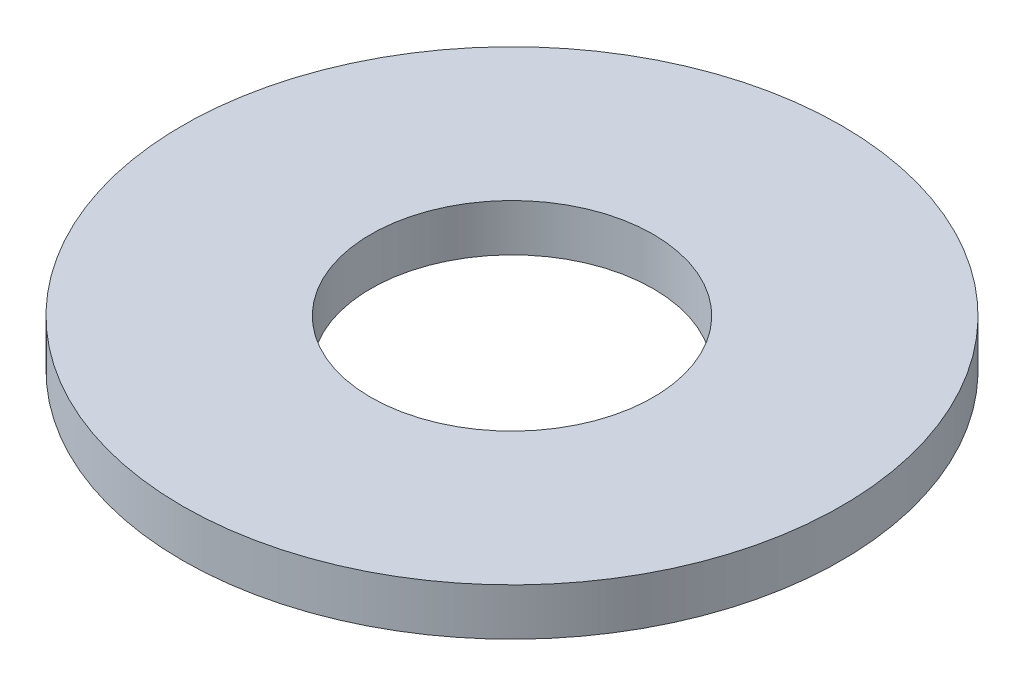
ISO-10303-21;
HEADER;
FILE_DESCRIPTION(('STEP AP214'),'2;1');
FILE_NAME('part.step','',(''),(''),'','','');
FILE_SCHEMA(('AUTOMOTIVE_DESIGN { 1 0 10303 214 1 1 1 1 }'));
ENDSEC;
DATA;
#1=APPLICATION_CONTEXT('core data for automotive mechanical design processes');
#2=APPLICATION_PROTOCOL_DEFINITION('international standard','automotive_design',2000,#1);
#3=PRODUCT_CONTEXT('',#1,'mechanical');
#4=PRODUCT('Part','Part','',(#3));
#5=PRODUCT_RELATED_PRODUCT_CATEGORY('part','',(#4));
#6=PRODUCT_DEFINITION_FORMATION('','',#4);
#7=PRODUCT_DEFINITION_CONTEXT('part definition',#1,'design');
#8=PRODUCT_DEFINITION('design','',#6,#7);
#9=PRODUCT_DEFINITION_SHAPE('','',#8);
#10=(LENGTH_UNIT() NAMED_UNIT(*) SI_UNIT(.MILLI.,.METRE.));
#11=(NAMED_UNIT(*) PLANE_ANGLE_UNIT() SI_UNIT($,.RADIAN.));
#12=(NAMED_UNIT(*) SI_UNIT($,.STERADIAN.) SOLID_ANGLE_UNIT());
#13=UNCERTAINTY_MEASURE_WITH_UNIT(LENGTH_MEASURE(1.E-05),#10,'distance_accuracy_value','');
#14=(GEOMETRIC_REPRESENTATION_CONTEXT(3) GLOBAL_UNCERTAINTY_ASSIGNED_CONTEXT((#13)) GLOBAL_UNIT_ASSIGNED_CONTEXT((#10,
#11,#12)) REPRESENTATION_CONTEXT('',''));
#15=CARTESIAN_POINT('',(0.,0.,0.));
#16=DIRECTION('',(0.,0.,1.));
#17=DIRECTION('',(1.,0.,0.));
#18=AXIS2_PLACEMENT_3D('',#15,#16,#17);
#19=CARTESIAN_POINT('',(0.,5.,0.));
#20=DIRECTION('',(0.,1.,0.));
#21=DIRECTION('',(0.,0.,1.));
#22=AXIS2_PLACEMENT_3D('',#19,#20,#21);
#23=PLANE('',#22);
#24=CARTESIAN_POINT('',(0.,5.,0.));
#25=DIRECTION('',(0.,1.,0.));
#26=DIRECTION('',(0.,0.,1.));
#27=AXIS2_PLACEMENT_3D('',#24,#25,#26);
#28=CIRCLE('',#27,35.);
#29=CARTESIAN_POINT('',(0.,5.,35.));
#30=VERTEX_POINT('',#29);
#31=EDGE_CURVE('E10',#30,#30,#28,.T.);
#32=ORIENTED_EDGE('',*,*,#31,.T.);
#33=EDGE_LOOP('',(#32));
#34=FACE_BOUND('',#33,.T.);
#35=CARTESIAN_POINT('',(0.,5.,0.));
#36=DIRECTION('',(0.,1.,0.));
#37=DIRECTION('',(0.,0.,1.));
#38=AXIS2_PLACEMENT_3D('',#35,#36,#37);
#39=CIRCLE('',#38,15.);
#40=CARTESIAN_POINT('',(0.,5.,15.));
#41=VERTEX_POINT('',#40);
#42=EDGE_CURVE('E42',#41,#41,#39,.T.);
#43=ORIENTED_EDGE('',*,*,#42,.F.);
#44=EDGE_LOOP('',(#43));
#45=FACE_BOUND('',#44,.T.);
#46=ADVANCED_FACE('F31',(#34,#45),#23,.T.);
#47=CARTESIAN_POINT('',(0.,0.,0.));
#48=DIRECTION('',(0.,1.,0.));
#49=DIRECTION('',(0.,0.,1.));
#50=AXIS2_PLACEMENT_3D('',#47,#48,#49);
#51=PLANE('',#50);
#52=CARTESIAN_POINT('',(0.,0.,0.));
#53=DIRECTION('',(0.,1.,0.));
#54=DIRECTION('',(0.,0.,1.));
#55=AXIS2_PLACEMENT_3D('',#52,#53,#54);
#56=CIRCLE('',#55,35.);
#57=CARTESIAN_POINT('',(0.,0.,35.));
#58=VERTEX_POINT('',#57);
#59=EDGE_CURVE('E35',#58,#58,#56,.T.);
#60=ORIENTED_EDGE('',*,*,#59,.F.);
#61=EDGE_LOOP('',(#60));
#62=FACE_BOUND('',#61,.T.);
#63=CARTESIAN_POINT('',(0.,0.,0.));
#64=DIRECTION('',(0.,1.,0.));
#65=DIRECTION('',(0.,0.,1.));
#66=AXIS2_PLACEMENT_3D('',#63,#64,#65);
#67=CIRCLE('',#66,15.);
#68=CARTESIAN_POINT('',(0.,0.,15.));
#69=VERTEX_POINT('',#68);
#70=EDGE_CURVE('E44',#69,#69,#67,.T.);
#71=ORIENTED_EDGE('',*,*,#70,.T.);
#72=EDGE_LOOP('',(#71));
#73=FACE_BOUND('',#72,.T.);
#74=ADVANCED_FACE('F54',(#62,#73),#51,.F.);
#75=CARTESIAN_POINT('',(0.,5.,0.));
#76=DIRECTION('',(0.,-1.,0.));
#77=DIRECTION('',(0.,0.,-1.));
#78=AXIS2_PLACEMENT_3D('',#75,#76,#77);
#79=CYLINDRICAL_SURFACE('',#78,35.);
#80=ORIENTED_EDGE('',*,*,#31,.F.);
#81=EDGE_LOOP('',(#80));
#82=FACE_BOUND('',#81,.T.);
#83=ORIENTED_EDGE('',*,*,#59,.T.);
#84=EDGE_LOOP('',(#83));
#85=FACE_BOUND('',#84,.T.);
#86=ADVANCED_FACE('F33',(#82,#85),#79,.T.);
#87=CARTESIAN_POINT('',(0.,5.,0.));
#88=DIRECTION('',(0.,-1.,0.));
#89=DIRECTION('',(0.,0.,-1.));
#90=AXIS2_PLACEMENT_3D('',#87,#88,#89);
#91=CYLINDRICAL_SURFACE('',#90,15.);
#92=ORIENTED_EDGE('',*,*,#42,.T.);
#93=EDGE_LOOP('',(#92));
#94=FACE_BOUND('',#93,.T.);
#95=ORIENTED_EDGE('',*,*,#70,.F.);
#96=EDGE_LOOP('',(#95));
#97=FACE_BOUND('',#96,.T.);
#98=ADVANCED_FACE('F50',(#94,#97),#91,.F.);
#99=CLOSED_SHELL('',(#46,#74,#86,#98));
#100=MANIFOLD_SOLID_BREP('B2',#99);
#101=ADVANCED_BREP_SHAPE_REPRESENTATION('',(#18,#100),#14);
#102=SHAPE_DEFINITION_REPRESENTATION(#9,#101);
ENDSEC;
END-ISO-10303-21;
